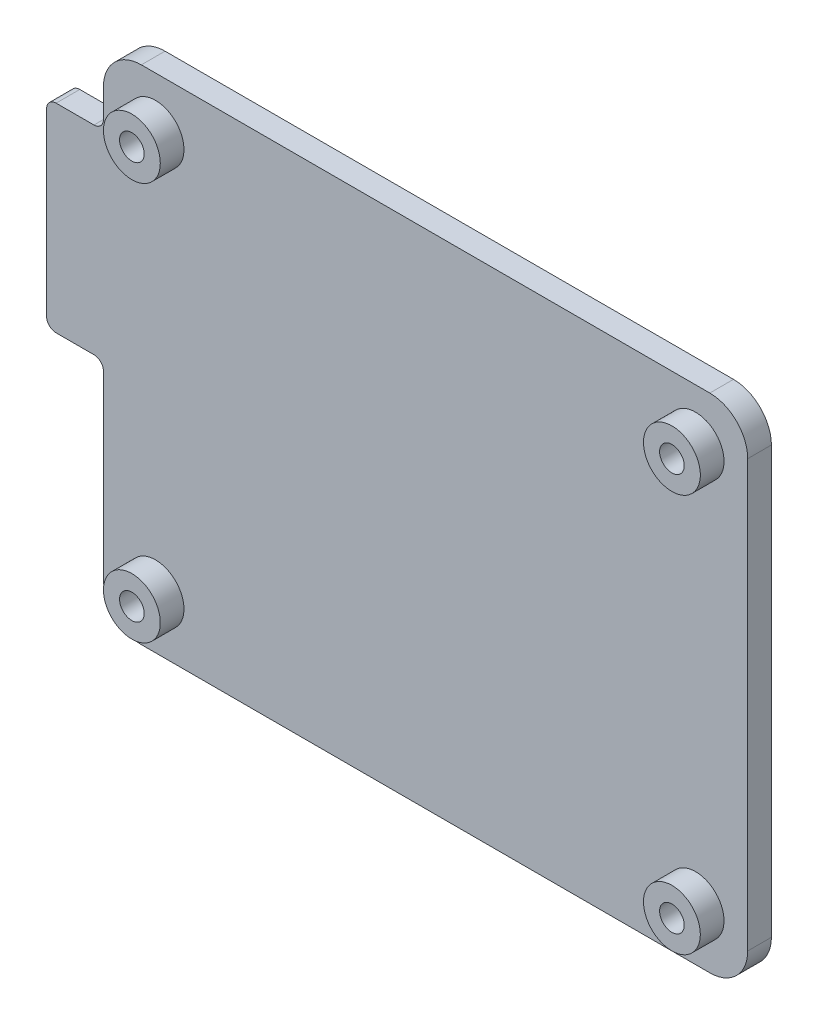
ISO-10303-21;
HEADER;
FILE_DESCRIPTION(('STEP AP214'),'2;1');
FILE_NAME('part.step','',(''),(''),'','','');
FILE_SCHEMA(('AUTOMOTIVE_DESIGN { 1 0 10303 214 1 1 1 1 }'));
ENDSEC;
DATA;
#1=APPLICATION_CONTEXT('core data for automotive mechanical design processes');
#2=APPLICATION_PROTOCOL_DEFINITION('international standard','automotive_design',2000,#1);
#3=PRODUCT_CONTEXT('',#1,'mechanical');
#4=PRODUCT('Part','Part','',(#3));
#5=PRODUCT_RELATED_PRODUCT_CATEGORY('part','',(#4));
#6=PRODUCT_DEFINITION_FORMATION('','',#4);
#7=PRODUCT_DEFINITION_CONTEXT('part definition',#1,'design');
#8=PRODUCT_DEFINITION('design','',#6,#7);
#9=PRODUCT_DEFINITION_SHAPE('','',#8);
#10=(LENGTH_UNIT() NAMED_UNIT(*) SI_UNIT(.MILLI.,.METRE.));
#11=(NAMED_UNIT(*) PLANE_ANGLE_UNIT() SI_UNIT($,.RADIAN.));
#12=(NAMED_UNIT(*) SI_UNIT($,.STERADIAN.) SOLID_ANGLE_UNIT());
#13=UNCERTAINTY_MEASURE_WITH_UNIT(LENGTH_MEASURE(1.E-05),#10,'distance_accuracy_value','');
#14=(GEOMETRIC_REPRESENTATION_CONTEXT(3) GLOBAL_UNCERTAINTY_ASSIGNED_CONTEXT((#13)) GLOBAL_UNIT_ASSIGNED_CONTEXT((#10,
#11,#12)) REPRESENTATION_CONTEXT('',''));
#15=CARTESIAN_POINT('',(0.,0.,0.));
#16=DIRECTION('',(0.,0.,1.));
#17=DIRECTION('',(1.,0.,0.));
#18=AXIS2_PLACEMENT_3D('',#15,#16,#17);
#19=CARTESIAN_POINT('',(-34.,-26.5,2.5));
#20=DIRECTION('',(1.,0.,0.));
#21=DIRECTION('',(0.,0.,-1.));
#22=AXIS2_PLACEMENT_3D('',#19,#20,#21);
#23=PLANE('',#22);
#24=DIRECTION('',(0.,-1.,0.));
#25=VECTOR('',#24,1.);
#26=CARTESIAN_POINT('',(-34.,-26.5,2.5));
#27=LINE('',#26,#25);
#28=CARTESIAN_POINT('',(-34.,-3.5,2.5));
#29=VERTEX_POINT('',#28);
#30=CARTESIAN_POINT('',(-34.,-22.5,2.5));
#31=VERTEX_POINT('',#30);
#32=EDGE_CURVE('E368',#29,#31,#27,.T.);
#33=ORIENTED_EDGE('',*,*,#32,.F.);
#34=DIRECTION('',(0.,0.,1.));
#35=VECTOR('',#34,1.);
#36=CARTESIAN_POINT('',(-34.,-3.5,2.5));
#37=LINE('',#36,#35);
#38=CARTESIAN_POINT('',(-34.,-3.5,0.));
#39=VERTEX_POINT('',#38);
#40=EDGE_CURVE('E280',#29,#39,#37,.F.);
#41=ORIENTED_EDGE('',*,*,#40,.T.);
#42=DIRECTION('',(0.,-1.,0.));
#43=VECTOR('',#42,1.);
#44=CARTESIAN_POINT('',(-34.,-26.5,0.));
#45=LINE('',#44,#43);
#46=CARTESIAN_POINT('',(-34.,-22.5,0.));
#47=VERTEX_POINT('',#46);
#48=EDGE_CURVE('E195',#39,#47,#45,.T.);
#49=ORIENTED_EDGE('',*,*,#48,.T.);
#50=DIRECTION('',(0.,0.,-1.));
#51=VECTOR('',#50,1.);
#52=CARTESIAN_POINT('',(-34.,-22.5,2.5));
#53=LINE('',#52,#51);
#54=EDGE_CURVE('E164',#47,#31,#53,.F.);
#55=ORIENTED_EDGE('',*,*,#54,.T.);
#56=EDGE_LOOP('',(#33,#41,#49,#55));
#57=FACE_BOUND('',#56,.T.);
#58=ADVANCED_FACE('F42',(#57),#23,.F.);
#59=CARTESIAN_POINT('',(34.,-26.5,2.5));
#60=DIRECTION('',(-1.,0.,0.));
#61=DIRECTION('',(0.,0.,1.));
#62=AXIS2_PLACEMENT_3D('',#59,#60,#61);
#63=PLANE('',#62);
#64=DIRECTION('',(0.,1.,0.));
#65=VECTOR('',#64,1.);
#66=CARTESIAN_POINT('',(34.,-26.5,2.5));
#67=LINE('',#66,#65);
#68=CARTESIAN_POINT('',(34.,-22.5,2.5));
#69=VERTEX_POINT('',#68);
#70=CARTESIAN_POINT('',(34.,22.5,2.5));
#71=VERTEX_POINT('',#70);
#72=EDGE_CURVE('E186',#69,#71,#67,.T.);
#73=ORIENTED_EDGE('',*,*,#72,.F.);
#74=DIRECTION('',(0.,0.,-1.));
#75=VECTOR('',#74,1.);
#76=CARTESIAN_POINT('',(34.,-22.5,2.5));
#77=LINE('',#76,#75);
#78=CARTESIAN_POINT('',(34.,-22.5,0.));
#79=VERTEX_POINT('',#78);
#80=EDGE_CURVE('E244',#69,#79,#77,.T.);
#81=ORIENTED_EDGE('',*,*,#80,.T.);
#82=DIRECTION('',(0.,1.,0.));
#83=VECTOR('',#82,1.);
#84=CARTESIAN_POINT('',(34.,-26.5,0.));
#85=LINE('',#84,#83);
#86=CARTESIAN_POINT('',(34.,22.5,0.));
#87=VERTEX_POINT('',#86);
#88=EDGE_CURVE('E357',#79,#87,#85,.T.);
#89=ORIENTED_EDGE('',*,*,#88,.T.);
#90=DIRECTION('',(0.,0.,-1.));
#91=VECTOR('',#90,1.);
#92=CARTESIAN_POINT('',(34.,22.5,2.5));
#93=LINE('',#92,#91);
#94=EDGE_CURVE('E241',#87,#71,#93,.F.);
#95=ORIENTED_EDGE('',*,*,#94,.T.);
#96=EDGE_LOOP('',(#73,#81,#89,#95));
#97=FACE_BOUND('',#96,.T.);
#98=ADVANCED_FACE('F470',(#97),#63,.F.);
#99=CARTESIAN_POINT('',(-34.,26.5,2.5));
#100=DIRECTION('',(0.,-1.,0.));
#101=DIRECTION('',(0.,0.,-1.));
#102=AXIS2_PLACEMENT_3D('',#99,#100,#101);
#103=PLANE('',#102);
#104=DIRECTION('',(-1.,0.,0.));
#105=VECTOR('',#104,1.);
#106=CARTESIAN_POINT('',(-34.,26.5,2.5));
#107=LINE('',#106,#105);
#108=CARTESIAN_POINT('',(30.,26.5,2.5));
#109=VERTEX_POINT('',#108);
#110=CARTESIAN_POINT('',(-30.,26.5,2.5));
#111=VERTEX_POINT('',#110);
#112=EDGE_CURVE('E192',#109,#111,#107,.T.);
#113=ORIENTED_EDGE('',*,*,#112,.F.);
#114=DIRECTION('',(0.,0.,-1.));
#115=VECTOR('',#114,1.);
#116=CARTESIAN_POINT('',(30.,26.5,2.5));
#117=LINE('',#116,#115);
#118=CARTESIAN_POINT('',(30.,26.5,0.));
#119=VERTEX_POINT('',#118);
#120=EDGE_CURVE('E251',#109,#119,#117,.T.);
#121=ORIENTED_EDGE('',*,*,#120,.T.);
#122=DIRECTION('',(-1.,0.,0.));
#123=VECTOR('',#122,1.);
#124=CARTESIAN_POINT('',(-34.,26.5,0.));
#125=LINE('',#124,#123);
#126=CARTESIAN_POINT('',(-30.,26.5,0.));
#127=VERTEX_POINT('',#126);
#128=EDGE_CURVE('E350',#119,#127,#125,.T.);
#129=ORIENTED_EDGE('',*,*,#128,.T.);
#130=DIRECTION('',(0.,0.,-1.));
#131=VECTOR('',#130,1.);
#132=CARTESIAN_POINT('',(-30.,26.5,2.5));
#133=LINE('',#132,#131);
#134=EDGE_CURVE('E248',#127,#111,#133,.F.);
#135=ORIENTED_EDGE('',*,*,#134,.T.);
#136=EDGE_LOOP('',(#113,#121,#129,#135));
#137=FACE_BOUND('',#136,.T.);
#138=ADVANCED_FACE('F353',(#137),#103,.F.);
#139=CARTESIAN_POINT('',(-34.,22.5,0.));
#140=VERTEX_POINT('',#139);
#141=CARTESIAN_POINT('',(-34.,19.5,0.));
#142=VERTEX_POINT('',#141);
#143=EDGE_CURVE('E187',#140,#142,#45,.T.);
#144=ORIENTED_EDGE('',*,*,#143,.T.);
#145=DIRECTION('',(0.,0.,1.));
#146=VECTOR('',#145,1.);
#147=CARTESIAN_POINT('',(-34.,19.5,2.5));
#148=LINE('',#147,#146);
#149=CARTESIAN_POINT('',(-34.,19.5,2.5));
#150=VERTEX_POINT('',#149);
#151=EDGE_CURVE('E283',#142,#150,#148,.T.);
#152=ORIENTED_EDGE('',*,*,#151,.T.);
#153=CARTESIAN_POINT('',(-34.,22.5,2.5));
#154=VERTEX_POINT('',#153);
#155=EDGE_CURVE('E325',#154,#150,#27,.T.);
#156=ORIENTED_EDGE('',*,*,#155,.F.);
#157=DIRECTION('',(0.,0.,-1.));
#158=VECTOR('',#157,1.);
#159=CARTESIAN_POINT('',(-34.,22.5,2.5));
#160=LINE('',#159,#158);
#161=EDGE_CURVE('E168',#154,#140,#160,.T.);
#162=ORIENTED_EDGE('',*,*,#161,.T.);
#163=EDGE_LOOP('',(#144,#152,#156,#162));
#164=FACE_BOUND('',#163,.T.);
#165=ADVANCED_FACE('F342',(#164),#23,.F.);
#166=CARTESIAN_POINT('',(-34.,-26.5,2.5));
#167=DIRECTION('',(0.,1.,0.));
#168=DIRECTION('',(0.,0.,1.));
#169=AXIS2_PLACEMENT_3D('',#166,#167,#168);
#170=PLANE('',#169);
#171=DIRECTION('',(1.,0.,0.));
#172=VECTOR('',#171,1.);
#173=CARTESIAN_POINT('',(-34.,-26.5,2.5));
#174=LINE('',#173,#172);
#175=CARTESIAN_POINT('',(-30.,-26.5,2.5));
#176=VERTEX_POINT('',#175);
#177=CARTESIAN_POINT('',(30.,-26.5,2.5));
#178=VERTEX_POINT('',#177);
#179=EDGE_CURVE('E178',#176,#178,#174,.T.);
#180=ORIENTED_EDGE('',*,*,#179,.F.);
#181=DIRECTION('',(0.,0.,-1.));
#182=VECTOR('',#181,1.);
#183=CARTESIAN_POINT('',(-30.,-26.5,2.5));
#184=LINE('',#183,#182);
#185=CARTESIAN_POINT('',(-30.,-26.5,0.));
#186=VERTEX_POINT('',#185);
#187=EDGE_CURVE('E162',#176,#186,#184,.T.);
#188=ORIENTED_EDGE('',*,*,#187,.T.);
#189=DIRECTION('',(1.,0.,0.));
#190=VECTOR('',#189,1.);
#191=CARTESIAN_POINT('',(-34.,-26.5,0.));
#192=LINE('',#191,#190);
#193=CARTESIAN_POINT('',(30.,-26.5,0.));
#194=VERTEX_POINT('',#193);
#195=EDGE_CURVE('E175',#186,#194,#192,.T.);
#196=ORIENTED_EDGE('',*,*,#195,.T.);
#197=DIRECTION('',(0.,0.,-1.));
#198=VECTOR('',#197,1.);
#199=CARTESIAN_POINT('',(30.,-26.5,2.5));
#200=LINE('',#199,#198);
#201=EDGE_CURVE('E181',#194,#178,#200,.F.);
#202=ORIENTED_EDGE('',*,*,#201,.T.);
#203=EDGE_LOOP('',(#180,#188,#196,#202));
#204=FACE_BOUND('',#203,.T.);
#205=ADVANCED_FACE('F174',(#204),#170,.F.);
#206=CARTESIAN_POINT('',(0.,0.,2.5));
#207=DIRECTION('',(0.,0.,-1.));
#208=DIRECTION('',(-1.,0.,0.));
#209=AXIS2_PLACEMENT_3D('',#206,#207,#208);
#210=PLANE('',#209);
#211=CARTESIAN_POINT('',(28.5,21.,2.5));
#212=DIRECTION('',(0.,0.,-1.));
#213=DIRECTION('',(-1.,0.,0.));
#214=AXIS2_PLACEMENT_3D('',#211,#212,#213);
#215=CIRCLE('',#214,2.99999999999999);
#216=CARTESIAN_POINT('',(25.5,21.,2.5));
#217=VERTEX_POINT('',#216);
#218=EDGE_CURVE('E211',#217,#217,#215,.F.);
#219=ORIENTED_EDGE('',*,*,#218,.F.);
#220=EDGE_LOOP('',(#219));
#221=FACE_BOUND('',#220,.T.);
#222=CARTESIAN_POINT('',(28.5,-21.,2.5));
#223=DIRECTION('',(0.,0.,-1.));
#224=DIRECTION('',(-1.,0.,0.));
#225=AXIS2_PLACEMENT_3D('',#222,#223,#224);
#226=CIRCLE('',#225,2.99999999999999);
#227=CARTESIAN_POINT('',(25.5,-21.,2.5));
#228=VERTEX_POINT('',#227);
#229=EDGE_CURVE('E207',#228,#228,#226,.F.);
#230=ORIENTED_EDGE('',*,*,#229,.F.);
#231=EDGE_LOOP('',(#230));
#232=FACE_BOUND('',#231,.T.);
#233=CARTESIAN_POINT('',(-28.5,-21.,2.5));
#234=DIRECTION('',(0.,0.,-1.));
#235=DIRECTION('',(-1.,0.,0.));
#236=AXIS2_PLACEMENT_3D('',#233,#234,#235);
#237=CIRCLE('',#236,2.99999999999999);
#238=CARTESIAN_POINT('',(-31.5,-21.,2.5));
#239=VERTEX_POINT('',#238);
#240=EDGE_CURVE('E203',#239,#239,#237,.F.);
#241=ORIENTED_EDGE('',*,*,#240,.F.);
#242=EDGE_LOOP('',(#241));
#243=FACE_BOUND('',#242,.T.);
#244=CARTESIAN_POINT('',(-28.5,21.,2.5));
#245=DIRECTION('',(0.,0.,-1.));
#246=DIRECTION('',(-1.,0.,0.));
#247=AXIS2_PLACEMENT_3D('',#244,#245,#246);
#248=CIRCLE('',#247,2.99999999999999);
#249=CARTESIAN_POINT('',(-31.5,21.,2.5));
#250=VERTEX_POINT('',#249);
#251=EDGE_CURVE('E199',#250,#250,#248,.F.);
#252=ORIENTED_EDGE('',*,*,#251,.F.);
#253=EDGE_LOOP('',(#252));
#254=FACE_BOUND('',#253,.T.);
#255=DIRECTION('',(0.,-1.,0.));
#256=VECTOR('',#255,1.);
#257=CARTESIAN_POINT('',(-40.,18.5,2.5));
#258=LINE('',#257,#256);
#259=CARTESIAN_POINT('',(-40.,17.5,2.5));
#260=VERTEX_POINT('',#259);
#261=CARTESIAN_POINT('',(-40.,-1.49999999999999,2.5));
#262=VERTEX_POINT('',#261);
#263=EDGE_CURVE('E335',#260,#262,#258,.T.);
#264=ORIENTED_EDGE('',*,*,#263,.T.);
#265=CARTESIAN_POINT('',(-39.,-1.5,2.5));
#266=DIRECTION('',(0.,0.,-1.));
#267=DIRECTION('',(-1.,0.,0.));
#268=AXIS2_PLACEMENT_3D('',#265,#266,#267);
#269=CIRCLE('',#268,1.);
#270=CARTESIAN_POINT('',(-39.,-2.5,2.5));
#271=VERTEX_POINT('',#270);
#272=EDGE_CURVE('E303',#262,#271,#269,.F.);
#273=ORIENTED_EDGE('',*,*,#272,.T.);
#274=DIRECTION('',(1.,0.,0.));
#275=VECTOR('',#274,1.);
#276=CARTESIAN_POINT('',(-34.,-2.5,2.5));
#277=LINE('',#276,#275);
#278=CARTESIAN_POINT('',(-35.,-2.5,2.5));
#279=VERTEX_POINT('',#278);
#280=EDGE_CURVE('E433',#271,#279,#277,.T.);
#281=ORIENTED_EDGE('',*,*,#280,.T.);
#282=CARTESIAN_POINT('',(-35.,-3.5,2.5));
#283=DIRECTION('',(0.,0.,-1.));
#284=DIRECTION('',(-1.,0.,0.));
#285=AXIS2_PLACEMENT_3D('',#282,#283,#284);
#286=CIRCLE('',#285,1.);
#287=EDGE_CURVE('E311',#279,#29,#286,.T.);
#288=ORIENTED_EDGE('',*,*,#287,.T.);
#289=ORIENTED_EDGE('',*,*,#32,.T.);
#290=CARTESIAN_POINT('',(-30.,-22.5,2.5));
#291=DIRECTION('',(0.,0.,-1.));
#292=DIRECTION('',(-1.,0.,0.));
#293=AXIS2_PLACEMENT_3D('',#290,#291,#292);
#294=CIRCLE('',#293,4.);
#295=EDGE_CURVE('E238',#31,#176,#294,.F.);
#296=ORIENTED_EDGE('',*,*,#295,.T.);
#297=ORIENTED_EDGE('',*,*,#179,.T.);
#298=CARTESIAN_POINT('',(30.,-22.5,2.5));
#299=DIRECTION('',(0.,0.,-1.));
#300=DIRECTION('',(-1.,0.,0.));
#301=AXIS2_PLACEMENT_3D('',#298,#299,#300);
#302=CIRCLE('',#301,4.);
#303=EDGE_CURVE('E235',#178,#69,#302,.F.);
#304=ORIENTED_EDGE('',*,*,#303,.T.);
#305=ORIENTED_EDGE('',*,*,#72,.T.);
#306=CARTESIAN_POINT('',(30.,22.5,2.5));
#307=DIRECTION('',(0.,0.,-1.));
#308=DIRECTION('',(-1.,0.,0.));
#309=AXIS2_PLACEMENT_3D('',#306,#307,#308);
#310=CIRCLE('',#309,4.);
#311=EDGE_CURVE('E232',#71,#109,#310,.F.);
#312=ORIENTED_EDGE('',*,*,#311,.T.);
#313=ORIENTED_EDGE('',*,*,#112,.T.);
#314=CARTESIAN_POINT('',(-30.,22.5,2.5));
#315=DIRECTION('',(0.,0.,-1.));
#316=DIRECTION('',(-1.,0.,0.));
#317=AXIS2_PLACEMENT_3D('',#314,#315,#316);
#318=CIRCLE('',#317,4.);
#319=EDGE_CURVE('E229',#111,#154,#318,.F.);
#320=ORIENTED_EDGE('',*,*,#319,.T.);
#321=ORIENTED_EDGE('',*,*,#155,.T.);
#322=CARTESIAN_POINT('',(-35.,19.5,2.5));
#323=DIRECTION('',(0.,0.,-1.));
#324=DIRECTION('',(-1.,0.,0.));
#325=AXIS2_PLACEMENT_3D('',#322,#323,#324);
#326=CIRCLE('',#325,1.);
#327=CARTESIAN_POINT('',(-35.,18.5,2.5));
#328=VERTEX_POINT('',#327);
#329=EDGE_CURVE('E51',#150,#328,#326,.T.);
#330=ORIENTED_EDGE('',*,*,#329,.T.);
#331=DIRECTION('',(-1.,0.,0.));
#332=VECTOR('',#331,1.);
#333=CARTESIAN_POINT('',(-34.,18.5,2.5));
#334=LINE('',#333,#332);
#335=CARTESIAN_POINT('',(-39.,18.5,2.5));
#336=VERTEX_POINT('',#335);
#337=EDGE_CURVE('E323',#328,#336,#334,.T.);
#338=ORIENTED_EDGE('',*,*,#337,.T.);
#339=CARTESIAN_POINT('',(-39.,17.5,2.5));
#340=DIRECTION('',(0.,0.,-1.));
#341=DIRECTION('',(-1.,0.,0.));
#342=AXIS2_PLACEMENT_3D('',#339,#340,#341);
#343=CIRCLE('',#342,1.);
#344=EDGE_CURVE('E300',#336,#260,#343,.F.);
#345=ORIENTED_EDGE('',*,*,#344,.T.);
#346=EDGE_LOOP('',(#264,#273,#281,#288,#289,#296,#297,#304,#305,#312,#313,#320,#321,#330,#338,#345));
#347=FACE_BOUND('',#346,.T.);
#348=ADVANCED_FACE('F322',(#221,#232,#243,#254,#347),#210,.F.);
#349=CARTESIAN_POINT('',(0.,0.,0.));
#350=DIRECTION('',(0.,0.,-1.));
#351=DIRECTION('',(-1.,0.,0.));
#352=AXIS2_PLACEMENT_3D('',#349,#350,#351);
#353=PLANE('',#352);
#354=CARTESIAN_POINT('',(28.5,21.,0.));
#355=DIRECTION('',(0.,0.,1.));
#356=DIRECTION('',(-1.,0.,0.));
#357=AXIS2_PLACEMENT_3D('',#354,#355,#356);
#358=CIRCLE('',#357,2.2);
#359=CARTESIAN_POINT('',(26.3,21.,0.));
#360=VERTEX_POINT('',#359);
#361=EDGE_CURVE('E273',#360,#360,#358,.T.);
#362=ORIENTED_EDGE('',*,*,#361,.T.);
#363=EDGE_LOOP('',(#362));
#364=FACE_BOUND('',#363,.T.);
#365=CARTESIAN_POINT('',(28.5,-21.,0.));
#366=DIRECTION('',(0.,0.,1.));
#367=DIRECTION('',(1.,0.,0.));
#368=AXIS2_PLACEMENT_3D('',#365,#366,#367);
#369=CIRCLE('',#368,2.2);
#370=CARTESIAN_POINT('',(30.7,-21.,0.));
#371=VERTEX_POINT('',#370);
#372=EDGE_CURVE('E418',#371,#371,#369,.T.);
#373=ORIENTED_EDGE('',*,*,#372,.T.);
#374=EDGE_LOOP('',(#373));
#375=FACE_BOUND('',#374,.T.);
#376=CARTESIAN_POINT('',(-28.5,-21.,0.));
#377=DIRECTION('',(0.,0.,1.));
#378=DIRECTION('',(-1.,0.,0.));
#379=AXIS2_PLACEMENT_3D('',#376,#377,#378);
#380=CIRCLE('',#379,2.2);
#381=CARTESIAN_POINT('',(-30.7,-21.,0.));
#382=VERTEX_POINT('',#381);
#383=EDGE_CURVE('E426',#382,#382,#380,.T.);
#384=ORIENTED_EDGE('',*,*,#383,.T.);
#385=EDGE_LOOP('',(#384));
#386=FACE_BOUND('',#385,.T.);
#387=CARTESIAN_POINT('',(-28.5,21.,0.));
#388=DIRECTION('',(0.,0.,1.));
#389=DIRECTION('',(1.,0.,0.));
#390=AXIS2_PLACEMENT_3D('',#387,#388,#389);
#391=CIRCLE('',#390,2.2);
#392=CARTESIAN_POINT('',(-26.3,21.,0.));
#393=VERTEX_POINT('',#392);
#394=EDGE_CURVE('E402',#393,#393,#391,.T.);
#395=ORIENTED_EDGE('',*,*,#394,.T.);
#396=EDGE_LOOP('',(#395));
#397=FACE_BOUND('',#396,.T.);
#398=DIRECTION('',(1.,0.,0.));
#399=VECTOR('',#398,1.);
#400=CARTESIAN_POINT('',(-34.,-2.5,0.));
#401=LINE('',#400,#399);
#402=CARTESIAN_POINT('',(-39.,-2.5,0.));
#403=VERTEX_POINT('',#402);
#404=CARTESIAN_POINT('',(-35.,-2.5,0.));
#405=VERTEX_POINT('',#404);
#406=EDGE_CURVE('E261',#403,#405,#401,.T.);
#407=ORIENTED_EDGE('',*,*,#406,.F.);
#408=CARTESIAN_POINT('',(-39.,-1.5,0.));
#409=DIRECTION('',(0.,0.,-1.));
#410=DIRECTION('',(-1.,0.,0.));
#411=AXIS2_PLACEMENT_3D('',#408,#409,#410);
#412=CIRCLE('',#411,1.);
#413=CARTESIAN_POINT('',(-40.,-1.49999999999999,0.));
#414=VERTEX_POINT('',#413);
#415=EDGE_CURVE('E58',#403,#414,#412,.T.);
#416=ORIENTED_EDGE('',*,*,#415,.T.);
#417=DIRECTION('',(0.,-1.,0.));
#418=VECTOR('',#417,1.);
#419=CARTESIAN_POINT('',(-40.,18.5,0.));
#420=LINE('',#419,#418);
#421=CARTESIAN_POINT('',(-40.,17.5,0.));
#422=VERTEX_POINT('',#421);
#423=EDGE_CURVE('E442',#422,#414,#420,.T.);
#424=ORIENTED_EDGE('',*,*,#423,.F.);
#425=CARTESIAN_POINT('',(-39.,17.5,0.));
#426=DIRECTION('',(0.,0.,-1.));
#427=DIRECTION('',(-1.,0.,0.));
#428=AXIS2_PLACEMENT_3D('',#425,#426,#427);
#429=CIRCLE('',#428,1.);
#430=CARTESIAN_POINT('',(-39.,18.5,0.));
#431=VERTEX_POINT('',#430);
#432=EDGE_CURVE('E306',#422,#431,#429,.T.);
#433=ORIENTED_EDGE('',*,*,#432,.T.);
#434=DIRECTION('',(-1.,0.,0.));
#435=VECTOR('',#434,1.);
#436=CARTESIAN_POINT('',(-34.,18.5,0.));
#437=LINE('',#436,#435);
#438=CARTESIAN_POINT('',(-35.,18.5,0.));
#439=VERTEX_POINT('',#438);
#440=EDGE_CURVE('E340',#439,#431,#437,.T.);
#441=ORIENTED_EDGE('',*,*,#440,.F.);
#442=CARTESIAN_POINT('',(-35.,19.5,0.));
#443=DIRECTION('',(0.,0.,-1.));
#444=DIRECTION('',(-1.,0.,0.));
#445=AXIS2_PLACEMENT_3D('',#442,#443,#444);
#446=CIRCLE('',#445,1.);
#447=EDGE_CURVE('E11',#439,#142,#446,.F.);
#448=ORIENTED_EDGE('',*,*,#447,.T.);
#449=ORIENTED_EDGE('',*,*,#143,.F.);
#450=CARTESIAN_POINT('',(-30.,22.5,0.));
#451=DIRECTION('',(0.,0.,-1.));
#452=DIRECTION('',(-1.,0.,0.));
#453=AXIS2_PLACEMENT_3D('',#450,#451,#452);
#454=CIRCLE('',#453,4.);
#455=EDGE_CURVE('E180',#140,#127,#454,.T.);
#456=ORIENTED_EDGE('',*,*,#455,.T.);
#457=ORIENTED_EDGE('',*,*,#128,.F.);
#458=CARTESIAN_POINT('',(30.,22.5,0.));
#459=DIRECTION('',(0.,0.,-1.));
#460=DIRECTION('',(-1.,0.,0.));
#461=AXIS2_PLACEMENT_3D('',#458,#459,#460);
#462=CIRCLE('',#461,4.);
#463=EDGE_CURVE('E219',#119,#87,#462,.T.);
#464=ORIENTED_EDGE('',*,*,#463,.T.);
#465=ORIENTED_EDGE('',*,*,#88,.F.);
#466=CARTESIAN_POINT('',(30.,-22.5,0.));
#467=DIRECTION('',(0.,0.,-1.));
#468=DIRECTION('',(-1.,0.,0.));
#469=AXIS2_PLACEMENT_3D('',#466,#467,#468);
#470=CIRCLE('',#469,4.);
#471=EDGE_CURVE('E169',#79,#194,#470,.T.);
#472=ORIENTED_EDGE('',*,*,#471,.T.);
#473=ORIENTED_EDGE('',*,*,#195,.F.);
#474=CARTESIAN_POINT('',(-30.,-22.5,0.));
#475=DIRECTION('',(0.,0.,-1.));
#476=DIRECTION('',(-1.,0.,0.));
#477=AXIS2_PLACEMENT_3D('',#474,#475,#476);
#478=CIRCLE('',#477,4.);
#479=EDGE_CURVE('E158',#186,#47,#478,.T.);
#480=ORIENTED_EDGE('',*,*,#479,.T.);
#481=ORIENTED_EDGE('',*,*,#48,.F.);
#482=CARTESIAN_POINT('',(-35.,-3.5,0.));
#483=DIRECTION('',(0.,0.,-1.));
#484=DIRECTION('',(-1.,0.,0.));
#485=AXIS2_PLACEMENT_3D('',#482,#483,#484);
#486=CIRCLE('',#485,1.);
#487=EDGE_CURVE('E314',#39,#405,#486,.F.);
#488=ORIENTED_EDGE('',*,*,#487,.T.);
#489=EDGE_LOOP('',(#407,#416,#424,#433,#441,#448,#449,#456,#457,#464,#465,#472,#473,#480,#481,#488));
#490=FACE_BOUND('',#489,.T.);
#491=ADVANCED_FACE('F183',(#364,#375,#386,#397,#490),#353,.T.);
#492=CARTESIAN_POINT('',(-28.5,21.,5.));
#493=DIRECTION('',(0.,0.,1.));
#494=DIRECTION('',(1.,0.,0.));
#495=AXIS2_PLACEMENT_3D('',#492,#493,#494);
#496=PLANE('',#495);
#497=CARTESIAN_POINT('',(-28.5,21.,5.));
#498=DIRECTION('',(0.,0.,1.));
#499=DIRECTION('',(1.,0.,0.));
#500=AXIS2_PLACEMENT_3D('',#497,#498,#499);
#501=CIRCLE('',#500,2.99999999999999);
#502=CARTESIAN_POINT('',(-25.5,21.,5.));
#503=VERTEX_POINT('',#502);
#504=EDGE_CURVE('E361',#503,#503,#501,.T.);
#505=ORIENTED_EDGE('',*,*,#504,.T.);
#506=EDGE_LOOP('',(#505));
#507=FACE_BOUND('',#506,.T.);
#508=CARTESIAN_POINT('',(-28.5,21.,5.));
#509=DIRECTION('',(0.,0.,1.));
#510=DIRECTION('',(1.,0.,0.));
#511=AXIS2_PLACEMENT_3D('',#508,#509,#510);
#512=CIRCLE('',#511,1.3);
#513=CARTESIAN_POINT('',(-27.2,21.,5.));
#514=VERTEX_POINT('',#513);
#515=EDGE_CURVE('E374',#514,#514,#512,.T.);
#516=ORIENTED_EDGE('',*,*,#515,.F.);
#517=EDGE_LOOP('',(#516));
#518=FACE_BOUND('',#517,.T.);
#519=ADVANCED_FACE('F548',(#507,#518),#496,.T.);
#520=CARTESIAN_POINT('',(-28.5,21.,5.));
#521=DIRECTION('',(0.,0.,-1.));
#522=DIRECTION('',(-1.,0.,0.));
#523=AXIS2_PLACEMENT_3D('',#520,#521,#522);
#524=CYLINDRICAL_SURFACE('',#523,2.99999999999999);
#525=ORIENTED_EDGE('',*,*,#504,.F.);
#526=EDGE_LOOP('',(#525));
#527=FACE_BOUND('',#526,.T.);
#528=ORIENTED_EDGE('',*,*,#251,.T.);
#529=EDGE_LOOP('',(#528));
#530=FACE_BOUND('',#529,.T.);
#531=ADVANCED_FACE('F546',(#527,#530),#524,.T.);
#532=CARTESIAN_POINT('',(-28.5,21.,5.));
#533=DIRECTION('',(0.,0.,-1.));
#534=DIRECTION('',(-1.,0.,0.));
#535=AXIS2_PLACEMENT_3D('',#532,#533,#534);
#536=CYLINDRICAL_SURFACE('',#535,1.3);
#537=ORIENTED_EDGE('',*,*,#515,.T.);
#538=EDGE_LOOP('',(#537));
#539=FACE_BOUND('',#538,.T.);
#540=CARTESIAN_POINT('',(-28.5,21.,1.8));
#541=DIRECTION('',(0.,0.,1.));
#542=DIRECTION('',(1.,0.,0.));
#543=AXIS2_PLACEMENT_3D('',#540,#541,#542);
#544=CIRCLE('',#543,1.3);
#545=CARTESIAN_POINT('',(-27.2,21.,1.8));
#546=VERTEX_POINT('',#545);
#547=EDGE_CURVE('E269',#546,#546,#544,.T.);
#548=ORIENTED_EDGE('',*,*,#547,.F.);
#549=EDGE_LOOP('',(#548));
#550=FACE_BOUND('',#549,.T.);
#551=ADVANCED_FACE('F539',(#539,#550),#536,.F.);
#552=CARTESIAN_POINT('',(-28.5,-21.,5.));
#553=DIRECTION('',(0.,0.,-1.));
#554=DIRECTION('',(-1.,0.,0.));
#555=AXIS2_PLACEMENT_3D('',#552,#553,#554);
#556=PLANE('',#555);
#557=CARTESIAN_POINT('',(-28.5,-21.,5.));
#558=DIRECTION('',(0.,0.,1.));
#559=DIRECTION('',(-1.,0.,0.));
#560=AXIS2_PLACEMENT_3D('',#557,#558,#559);
#561=CIRCLE('',#560,2.99999999999999);
#562=CARTESIAN_POINT('',(-31.5,-21.,5.));
#563=VERTEX_POINT('',#562);
#564=EDGE_CURVE('E382',#563,#563,#561,.T.);
#565=ORIENTED_EDGE('',*,*,#564,.T.);
#566=EDGE_LOOP('',(#565));
#567=FACE_BOUND('',#566,.T.);
#568=CARTESIAN_POINT('',(-28.5,-21.,5.));
#569=DIRECTION('',(0.,0.,1.));
#570=DIRECTION('',(-1.,0.,0.));
#571=AXIS2_PLACEMENT_3D('',#568,#569,#570);
#572=CIRCLE('',#571,1.3);
#573=CARTESIAN_POINT('',(-29.8,-21.,5.));
#574=VERTEX_POINT('',#573);
#575=EDGE_CURVE('E378',#574,#574,#572,.T.);
#576=ORIENTED_EDGE('',*,*,#575,.F.);
#577=EDGE_LOOP('',(#576));
#578=FACE_BOUND('',#577,.T.);
#579=ADVANCED_FACE('F535',(#567,#578),#556,.F.);
#580=CARTESIAN_POINT('',(-28.5,-21.,5.));
#581=DIRECTION('',(0.,0.,-1.));
#582=DIRECTION('',(-1.,0.,0.));
#583=AXIS2_PLACEMENT_3D('',#580,#581,#582);
#584=CYLINDRICAL_SURFACE('',#583,2.99999999999999);
#585=ORIENTED_EDGE('',*,*,#564,.F.);
#586=EDGE_LOOP('',(#585));
#587=FACE_BOUND('',#586,.T.);
#588=ORIENTED_EDGE('',*,*,#240,.T.);
#589=EDGE_LOOP('',(#588));
#590=FACE_BOUND('',#589,.T.);
#591=ADVANCED_FACE('F532',(#587,#590),#584,.T.);
#592=CARTESIAN_POINT('',(-28.5,-21.,5.));
#593=DIRECTION('',(0.,0.,-1.));
#594=DIRECTION('',(-1.,0.,0.));
#595=AXIS2_PLACEMENT_3D('',#592,#593,#594);
#596=CYLINDRICAL_SURFACE('',#595,1.3);
#597=ORIENTED_EDGE('',*,*,#575,.T.);
#598=EDGE_LOOP('',(#597));
#599=FACE_BOUND('',#598,.T.);
#600=CARTESIAN_POINT('',(-28.5,-21.,1.8));
#601=DIRECTION('',(0.,0.,-1.));
#602=DIRECTION('',(-1.,0.,0.));
#603=AXIS2_PLACEMENT_3D('',#600,#601,#602);
#604=CIRCLE('',#603,1.3);
#605=CARTESIAN_POINT('',(-29.8,-21.,1.8));
#606=VERTEX_POINT('',#605);
#607=EDGE_CURVE('E265',#606,#606,#604,.T.);
#608=ORIENTED_EDGE('',*,*,#607,.T.);
#609=EDGE_LOOP('',(#608));
#610=FACE_BOUND('',#609,.T.);
#611=ADVANCED_FACE('F527',(#599,#610),#596,.F.);
#612=CARTESIAN_POINT('',(28.5,-21.,5.));
#613=DIRECTION('',(0.,0.,1.));
#614=DIRECTION('',(1.,0.,0.));
#615=AXIS2_PLACEMENT_3D('',#612,#613,#614);
#616=PLANE('',#615);
#617=CARTESIAN_POINT('',(28.5,-21.,5.));
#618=DIRECTION('',(0.,0.,1.));
#619=DIRECTION('',(1.,0.,0.));
#620=AXIS2_PLACEMENT_3D('',#617,#618,#619);
#621=CIRCLE('',#620,2.99999999999999);
#622=CARTESIAN_POINT('',(31.5,-21.,5.));
#623=VERTEX_POINT('',#622);
#624=EDGE_CURVE('E390',#623,#623,#621,.T.);
#625=ORIENTED_EDGE('',*,*,#624,.T.);
#626=EDGE_LOOP('',(#625));
#627=FACE_BOUND('',#626,.T.);
#628=CARTESIAN_POINT('',(28.5,-21.,5.));
#629=DIRECTION('',(0.,0.,1.));
#630=DIRECTION('',(1.,0.,0.));
#631=AXIS2_PLACEMENT_3D('',#628,#629,#630);
#632=CIRCLE('',#631,1.3);
#633=CARTESIAN_POINT('',(29.8,-21.,5.));
#634=VERTEX_POINT('',#633);
#635=EDGE_CURVE('E386',#634,#634,#632,.T.);
#636=ORIENTED_EDGE('',*,*,#635,.F.);
#637=EDGE_LOOP('',(#636));
#638=FACE_BOUND('',#637,.T.);
#639=ADVANCED_FACE('F523',(#627,#638),#616,.T.);
#640=CARTESIAN_POINT('',(28.5,-21.,5.));
#641=DIRECTION('',(0.,0.,-1.));
#642=DIRECTION('',(-1.,0.,0.));
#643=AXIS2_PLACEMENT_3D('',#640,#641,#642);
#644=CYLINDRICAL_SURFACE('',#643,2.99999999999999);
#645=ORIENTED_EDGE('',*,*,#624,.F.);
#646=EDGE_LOOP('',(#645));
#647=FACE_BOUND('',#646,.T.);
#648=ORIENTED_EDGE('',*,*,#229,.T.);
#649=EDGE_LOOP('',(#648));
#650=FACE_BOUND('',#649,.T.);
#651=ADVANCED_FACE('F519',(#647,#650),#644,.T.);
#652=CARTESIAN_POINT('',(28.5,-21.,5.));
#653=DIRECTION('',(0.,0.,-1.));
#654=DIRECTION('',(-1.,0.,0.));
#655=AXIS2_PLACEMENT_3D('',#652,#653,#654);
#656=CYLINDRICAL_SURFACE('',#655,1.3);
#657=ORIENTED_EDGE('',*,*,#635,.T.);
#658=EDGE_LOOP('',(#657));
#659=FACE_BOUND('',#658,.T.);
#660=CARTESIAN_POINT('',(28.5,-21.,1.8));
#661=DIRECTION('',(0.,0.,1.));
#662=DIRECTION('',(1.,0.,0.));
#663=AXIS2_PLACEMENT_3D('',#660,#661,#662);
#664=CIRCLE('',#663,1.3);
#665=CARTESIAN_POINT('',(29.8,-21.,1.8));
#666=VERTEX_POINT('',#665);
#667=EDGE_CURVE('E260',#666,#666,#664,.T.);
#668=ORIENTED_EDGE('',*,*,#667,.F.);
#669=EDGE_LOOP('',(#668));
#670=FACE_BOUND('',#669,.T.);
#671=ADVANCED_FACE('F522',(#659,#670),#656,.F.);
#672=CARTESIAN_POINT('',(28.5,21.,5.));
#673=DIRECTION('',(0.,0.,-1.));
#674=DIRECTION('',(-1.,0.,0.));
#675=AXIS2_PLACEMENT_3D('',#672,#673,#674);
#676=PLANE('',#675);
#677=CARTESIAN_POINT('',(28.5,21.,5.));
#678=DIRECTION('',(0.,0.,1.));
#679=DIRECTION('',(-1.,0.,0.));
#680=AXIS2_PLACEMENT_3D('',#677,#678,#679);
#681=CIRCLE('',#680,2.99999999999999);
#682=CARTESIAN_POINT('',(25.5,21.,5.));
#683=VERTEX_POINT('',#682);
#684=EDGE_CURVE('E398',#683,#683,#681,.T.);
#685=ORIENTED_EDGE('',*,*,#684,.T.);
#686=EDGE_LOOP('',(#685));
#687=FACE_BOUND('',#686,.T.);
#688=CARTESIAN_POINT('',(28.5,21.,5.));
#689=DIRECTION('',(0.,0.,1.));
#690=DIRECTION('',(-1.,0.,0.));
#691=AXIS2_PLACEMENT_3D('',#688,#689,#690);
#692=CIRCLE('',#691,1.3);
#693=CARTESIAN_POINT('',(27.2,21.,5.));
#694=VERTEX_POINT('',#693);
#695=EDGE_CURVE('E394',#694,#694,#692,.T.);
#696=ORIENTED_EDGE('',*,*,#695,.F.);
#697=EDGE_LOOP('',(#696));
#698=FACE_BOUND('',#697,.T.);
#699=ADVANCED_FACE('F513',(#687,#698),#676,.F.);
#700=CARTESIAN_POINT('',(28.5,21.,5.));
#701=DIRECTION('',(0.,0.,-1.));
#702=DIRECTION('',(-1.,0.,0.));
#703=AXIS2_PLACEMENT_3D('',#700,#701,#702);
#704=CYLINDRICAL_SURFACE('',#703,2.99999999999999);
#705=ORIENTED_EDGE('',*,*,#684,.F.);
#706=EDGE_LOOP('',(#705));
#707=FACE_BOUND('',#706,.T.);
#708=ORIENTED_EDGE('',*,*,#218,.T.);
#709=EDGE_LOOP('',(#708));
#710=FACE_BOUND('',#709,.T.);
#711=ADVANCED_FACE('F507',(#707,#710),#704,.T.);
#712=CARTESIAN_POINT('',(28.5,21.,5.));
#713=DIRECTION('',(0.,0.,-1.));
#714=DIRECTION('',(-1.,0.,0.));
#715=AXIS2_PLACEMENT_3D('',#712,#713,#714);
#716=CYLINDRICAL_SURFACE('',#715,1.3);
#717=ORIENTED_EDGE('',*,*,#695,.T.);
#718=EDGE_LOOP('',(#717));
#719=FACE_BOUND('',#718,.T.);
#720=CARTESIAN_POINT('',(28.5,21.,1.8));
#721=DIRECTION('',(0.,0.,-1.));
#722=DIRECTION('',(-1.,0.,0.));
#723=AXIS2_PLACEMENT_3D('',#720,#721,#722);
#724=CIRCLE('',#723,1.3);
#725=CARTESIAN_POINT('',(27.2,21.,1.8));
#726=VERTEX_POINT('',#725);
#727=EDGE_CURVE('E256',#726,#726,#724,.T.);
#728=ORIENTED_EDGE('',*,*,#727,.T.);
#729=EDGE_LOOP('',(#728));
#730=FACE_BOUND('',#729,.T.);
#731=ADVANCED_FACE('F503',(#719,#730),#716,.F.);
#732=CARTESIAN_POINT('',(-30.,-22.5,2.5));
#733=DIRECTION('',(0.,0.,-1.));
#734=DIRECTION('',(-1.,0.,0.));
#735=AXIS2_PLACEMENT_3D('',#732,#733,#734);
#736=CYLINDRICAL_SURFACE('',#735,4.);
#737=ORIENTED_EDGE('',*,*,#295,.F.);
#738=ORIENTED_EDGE('',*,*,#54,.F.);
#739=ORIENTED_EDGE('',*,*,#479,.F.);
#740=ORIENTED_EDGE('',*,*,#187,.F.);
#741=EDGE_LOOP('',(#737,#738,#739,#740));
#742=FACE_BOUND('',#741,.T.);
#743=ADVANCED_FACE('F161',(#742),#736,.T.);
#744=CARTESIAN_POINT('',(30.,-22.5,2.5));
#745=DIRECTION('',(0.,0.,-1.));
#746=DIRECTION('',(-1.,0.,0.));
#747=AXIS2_PLACEMENT_3D('',#744,#745,#746);
#748=CYLINDRICAL_SURFACE('',#747,4.);
#749=ORIENTED_EDGE('',*,*,#303,.F.);
#750=ORIENTED_EDGE('',*,*,#201,.F.);
#751=ORIENTED_EDGE('',*,*,#471,.F.);
#752=ORIENTED_EDGE('',*,*,#80,.F.);
#753=EDGE_LOOP('',(#749,#750,#751,#752));
#754=FACE_BOUND('',#753,.T.);
#755=ADVANCED_FACE('F468',(#754),#748,.T.);
#756=CARTESIAN_POINT('',(30.,22.5,2.5));
#757=DIRECTION('',(0.,0.,-1.));
#758=DIRECTION('',(-1.,0.,0.));
#759=AXIS2_PLACEMENT_3D('',#756,#757,#758);
#760=CYLINDRICAL_SURFACE('',#759,4.);
#761=ORIENTED_EDGE('',*,*,#311,.F.);
#762=ORIENTED_EDGE('',*,*,#94,.F.);
#763=ORIENTED_EDGE('',*,*,#463,.F.);
#764=ORIENTED_EDGE('',*,*,#120,.F.);
#765=EDGE_LOOP('',(#761,#762,#763,#764));
#766=FACE_BOUND('',#765,.T.);
#767=ADVANCED_FACE('F474',(#766),#760,.T.);
#768=CARTESIAN_POINT('',(-30.,22.5,2.5));
#769=DIRECTION('',(0.,0.,-1.));
#770=DIRECTION('',(-1.,0.,0.));
#771=AXIS2_PLACEMENT_3D('',#768,#769,#770);
#772=CYLINDRICAL_SURFACE('',#771,4.);
#773=ORIENTED_EDGE('',*,*,#319,.F.);
#774=ORIENTED_EDGE('',*,*,#134,.F.);
#775=ORIENTED_EDGE('',*,*,#455,.F.);
#776=ORIENTED_EDGE('',*,*,#161,.F.);
#777=EDGE_LOOP('',(#773,#774,#775,#776));
#778=FACE_BOUND('',#777,.T.);
#779=ADVANCED_FACE('F346',(#778),#772,.T.);
#780=CARTESIAN_POINT('',(-28.5,21.,0.));
#781=DIRECTION('',(0.,0.,1.));
#782=DIRECTION('',(1.,0.,0.));
#783=AXIS2_PLACEMENT_3D('',#780,#781,#782);
#784=CYLINDRICAL_SURFACE('',#783,2.2);
#785=ORIENTED_EDGE('',*,*,#394,.F.);
#786=EDGE_LOOP('',(#785));
#787=FACE_BOUND('',#786,.T.);
#788=CARTESIAN_POINT('',(-28.5,21.,1.8));
#789=DIRECTION('',(0.,0.,1.));
#790=DIRECTION('',(1.,0.,0.));
#791=AXIS2_PLACEMENT_3D('',#788,#789,#790);
#792=CIRCLE('',#791,2.2);
#793=CARTESIAN_POINT('',(-26.3,21.,1.8));
#794=VERTEX_POINT('',#793);
#795=EDGE_CURVE('E403',#794,#794,#792,.T.);
#796=ORIENTED_EDGE('',*,*,#795,.T.);
#797=EDGE_LOOP('',(#796));
#798=FACE_BOUND('',#797,.T.);
#799=ADVANCED_FACE('F481',(#787,#798),#784,.F.);
#800=CARTESIAN_POINT('',(-28.5,21.,1.8));
#801=DIRECTION('',(0.,0.,1.));
#802=DIRECTION('',(1.,0.,0.));
#803=AXIS2_PLACEMENT_3D('',#800,#801,#802);
#804=PLANE('',#803);
#805=ORIENTED_EDGE('',*,*,#547,.T.);
#806=EDGE_LOOP('',(#805));
#807=FACE_BOUND('',#806,.T.);
#808=ORIENTED_EDGE('',*,*,#795,.F.);
#809=EDGE_LOOP('',(#808));
#810=FACE_BOUND('',#809,.T.);
#811=ADVANCED_FACE('F572',(#807,#810),#804,.F.);
#812=CARTESIAN_POINT('',(-28.5,-21.,0.));
#813=DIRECTION('',(0.,0.,1.));
#814=DIRECTION('',(1.,0.,0.));
#815=AXIS2_PLACEMENT_3D('',#812,#813,#814);
#816=CYLINDRICAL_SURFACE('',#815,2.2);
#817=ORIENTED_EDGE('',*,*,#383,.F.);
#818=EDGE_LOOP('',(#817));
#819=FACE_BOUND('',#818,.T.);
#820=CARTESIAN_POINT('',(-28.5,-21.,1.8));
#821=DIRECTION('',(0.,0.,1.));
#822=DIRECTION('',(-1.,0.,0.));
#823=AXIS2_PLACEMENT_3D('',#820,#821,#822);
#824=CIRCLE('',#823,2.2);
#825=CARTESIAN_POINT('',(-30.7,-21.,1.8));
#826=VERTEX_POINT('',#825);
#827=EDGE_CURVE('E407',#826,#826,#824,.T.);
#828=ORIENTED_EDGE('',*,*,#827,.T.);
#829=EDGE_LOOP('',(#828));
#830=FACE_BOUND('',#829,.T.);
#831=ADVANCED_FACE('F577',(#819,#830),#816,.F.);
#832=CARTESIAN_POINT('',(-28.5,-21.,1.8));
#833=DIRECTION('',(0.,0.,-1.));
#834=DIRECTION('',(-1.,0.,0.));
#835=AXIS2_PLACEMENT_3D('',#832,#833,#834);
#836=PLANE('',#835);
#837=ORIENTED_EDGE('',*,*,#607,.F.);
#838=EDGE_LOOP('',(#837));
#839=FACE_BOUND('',#838,.T.);
#840=ORIENTED_EDGE('',*,*,#827,.F.);
#841=EDGE_LOOP('',(#840));
#842=FACE_BOUND('',#841,.T.);
#843=ADVANCED_FACE('F583',(#839,#842),#836,.T.);
#844=CARTESIAN_POINT('',(28.5,-21.,0.));
#845=DIRECTION('',(0.,0.,1.));
#846=DIRECTION('',(1.,0.,0.));
#847=AXIS2_PLACEMENT_3D('',#844,#845,#846);
#848=CYLINDRICAL_SURFACE('',#847,2.2);
#849=ORIENTED_EDGE('',*,*,#372,.F.);
#850=EDGE_LOOP('',(#849));
#851=FACE_BOUND('',#850,.T.);
#852=CARTESIAN_POINT('',(28.5,-21.,1.8));
#853=DIRECTION('',(0.,0.,1.));
#854=DIRECTION('',(1.,0.,0.));
#855=AXIS2_PLACEMENT_3D('',#852,#853,#854);
#856=CIRCLE('',#855,2.2);
#857=CARTESIAN_POINT('',(30.7,-21.,1.8));
#858=VERTEX_POINT('',#857);
#859=EDGE_CURVE('E422',#858,#858,#856,.T.);
#860=ORIENTED_EDGE('',*,*,#859,.T.);
#861=EDGE_LOOP('',(#860));
#862=FACE_BOUND('',#861,.T.);
#863=ADVANCED_FACE('F598',(#851,#862),#848,.F.);
#864=CARTESIAN_POINT('',(28.5,-21.,1.8));
#865=DIRECTION('',(0.,0.,1.));
#866=DIRECTION('',(1.,0.,0.));
#867=AXIS2_PLACEMENT_3D('',#864,#865,#866);
#868=PLANE('',#867);
#869=ORIENTED_EDGE('',*,*,#667,.T.);
#870=EDGE_LOOP('',(#869));
#871=FACE_BOUND('',#870,.T.);
#872=ORIENTED_EDGE('',*,*,#859,.F.);
#873=EDGE_LOOP('',(#872));
#874=FACE_BOUND('',#873,.T.);
#875=ADVANCED_FACE('F594',(#871,#874),#868,.F.);
#876=CARTESIAN_POINT('',(28.5,21.,0.));
#877=DIRECTION('',(0.,0.,1.));
#878=DIRECTION('',(1.,0.,0.));
#879=AXIS2_PLACEMENT_3D('',#876,#877,#878);
#880=CYLINDRICAL_SURFACE('',#879,2.2);
#881=ORIENTED_EDGE('',*,*,#361,.F.);
#882=EDGE_LOOP('',(#881));
#883=FACE_BOUND('',#882,.T.);
#884=CARTESIAN_POINT('',(28.5,21.,1.8));
#885=DIRECTION('',(0.,0.,1.));
#886=DIRECTION('',(-1.,0.,0.));
#887=AXIS2_PLACEMENT_3D('',#884,#885,#886);
#888=CIRCLE('',#887,2.2);
#889=CARTESIAN_POINT('',(26.3,21.,1.8));
#890=VERTEX_POINT('',#889);
#891=EDGE_CURVE('E414',#890,#890,#888,.T.);
#892=ORIENTED_EDGE('',*,*,#891,.T.);
#893=EDGE_LOOP('',(#892));
#894=FACE_BOUND('',#893,.T.);
#895=ADVANCED_FACE('F590',(#883,#894),#880,.F.);
#896=CARTESIAN_POINT('',(28.5,21.,1.8));
#897=DIRECTION('',(0.,0.,-1.));
#898=DIRECTION('',(-1.,0.,0.));
#899=AXIS2_PLACEMENT_3D('',#896,#897,#898);
#900=PLANE('',#899);
#901=ORIENTED_EDGE('',*,*,#727,.F.);
#902=EDGE_LOOP('',(#901));
#903=FACE_BOUND('',#902,.T.);
#904=ORIENTED_EDGE('',*,*,#891,.F.);
#905=EDGE_LOOP('',(#904));
#906=FACE_BOUND('',#905,.T.);
#907=ADVANCED_FACE('F587',(#903,#906),#900,.T.);
#908=CARTESIAN_POINT('',(-34.,-2.5,0.));
#909=DIRECTION('',(0.,-1.,0.));
#910=DIRECTION('',(1.,0.,0.));
#911=AXIS2_PLACEMENT_3D('',#908,#909,#910);
#912=PLANE('',#911);
#913=ORIENTED_EDGE('',*,*,#406,.T.);
#914=DIRECTION('',(0.,0.,1.));
#915=VECTOR('',#914,1.);
#916=CARTESIAN_POINT('',(-35.,-2.5,0.));
#917=LINE('',#916,#915);
#918=EDGE_CURVE('E276',#405,#279,#917,.T.);
#919=ORIENTED_EDGE('',*,*,#918,.T.);
#920=ORIENTED_EDGE('',*,*,#280,.F.);
#921=DIRECTION('',(0.,0.,1.));
#922=VECTOR('',#921,1.);
#923=CARTESIAN_POINT('',(-39.,-2.5,0.));
#924=LINE('',#923,#922);
#925=EDGE_CURVE('E255',#271,#403,#924,.F.);
#926=ORIENTED_EDGE('',*,*,#925,.T.);
#927=EDGE_LOOP('',(#913,#919,#920,#926));
#928=FACE_BOUND('',#927,.T.);
#929=ADVANCED_FACE('F455',(#928),#912,.T.);
#930=CARTESIAN_POINT('',(-40.,18.5,0.));
#931=DIRECTION('',(-1.,0.,0.));
#932=DIRECTION('',(0.,-1.,0.));
#933=AXIS2_PLACEMENT_3D('',#930,#931,#932);
#934=PLANE('',#933);
#935=ORIENTED_EDGE('',*,*,#423,.T.);
#936=DIRECTION('',(0.,0.,1.));
#937=VECTOR('',#936,1.);
#938=CARTESIAN_POINT('',(-40.,-1.5,0.));
#939=LINE('',#938,#937);
#940=EDGE_CURVE('E296',#414,#262,#939,.T.);
#941=ORIENTED_EDGE('',*,*,#940,.T.);
#942=ORIENTED_EDGE('',*,*,#263,.F.);
#943=DIRECTION('',(0.,0.,1.));
#944=VECTOR('',#943,1.);
#945=CARTESIAN_POINT('',(-40.,17.5,0.));
#946=LINE('',#945,#944);
#947=EDGE_CURVE('E65',#260,#422,#946,.F.);
#948=ORIENTED_EDGE('',*,*,#947,.T.);
#949=EDGE_LOOP('',(#935,#941,#942,#948));
#950=FACE_BOUND('',#949,.T.);
#951=ADVANCED_FACE('F448',(#950),#934,.T.);
#952=CARTESIAN_POINT('',(-34.,18.5,0.));
#953=DIRECTION('',(0.,1.,0.));
#954=DIRECTION('',(0.,0.,1.));
#955=AXIS2_PLACEMENT_3D('',#952,#953,#954);
#956=PLANE('',#955);
#957=ORIENTED_EDGE('',*,*,#337,.F.);
#958=DIRECTION('',(0.,0.,1.));
#959=VECTOR('',#958,1.);
#960=CARTESIAN_POINT('',(-35.,18.5,0.));
#961=LINE('',#960,#959);
#962=EDGE_CURVE('E291',#328,#439,#961,.F.);
#963=ORIENTED_EDGE('',*,*,#962,.T.);
#964=ORIENTED_EDGE('',*,*,#440,.T.);
#965=DIRECTION('',(0.,0.,1.));
#966=VECTOR('',#965,1.);
#967=CARTESIAN_POINT('',(-39.,18.5,0.));
#968=LINE('',#967,#966);
#969=EDGE_CURVE('E287',#431,#336,#968,.T.);
#970=ORIENTED_EDGE('',*,*,#969,.T.);
#971=EDGE_LOOP('',(#957,#963,#964,#970));
#972=FACE_BOUND('',#971,.T.);
#973=ADVANCED_FACE('F330',(#972),#956,.T.);
#974=CARTESIAN_POINT('',(-35.,-3.5,0.));
#975=DIRECTION('',(0.,0.,1.));
#976=DIRECTION('',(1.,0.,0.));
#977=AXIS2_PLACEMENT_3D('',#974,#975,#976);
#978=CYLINDRICAL_SURFACE('',#977,1.);
#979=ORIENTED_EDGE('',*,*,#487,.F.);
#980=ORIENTED_EDGE('',*,*,#40,.F.);
#981=ORIENTED_EDGE('',*,*,#287,.F.);
#982=ORIENTED_EDGE('',*,*,#918,.F.);
#983=EDGE_LOOP('',(#979,#980,#981,#982));
#984=FACE_BOUND('',#983,.T.);
#985=ADVANCED_FACE('F459',(#984),#978,.F.);
#986=CARTESIAN_POINT('',(-35.,19.5,2.5));
#987=DIRECTION('',(0.,0.,1.));
#988=DIRECTION('',(1.,0.,0.));
#989=AXIS2_PLACEMENT_3D('',#986,#987,#988);
#990=CYLINDRICAL_SURFACE('',#989,1.);
#991=ORIENTED_EDGE('',*,*,#447,.F.);
#992=ORIENTED_EDGE('',*,*,#962,.F.);
#993=ORIENTED_EDGE('',*,*,#329,.F.);
#994=ORIENTED_EDGE('',*,*,#151,.F.);
#995=EDGE_LOOP('',(#991,#992,#993,#994));
#996=FACE_BOUND('',#995,.T.);
#997=ADVANCED_FACE('F338',(#996),#990,.F.);
#998=CARTESIAN_POINT('',(-39.,-1.5,0.));
#999=DIRECTION('',(0.,0.,1.));
#1000=DIRECTION('',(1.,0.,0.));
#1001=AXIS2_PLACEMENT_3D('',#998,#999,#1000);
#1002=CYLINDRICAL_SURFACE('',#1001,1.);
#1003=ORIENTED_EDGE('',*,*,#415,.F.);
#1004=ORIENTED_EDGE('',*,*,#925,.F.);
#1005=ORIENTED_EDGE('',*,*,#272,.F.);
#1006=ORIENTED_EDGE('',*,*,#940,.F.);
#1007=EDGE_LOOP('',(#1003,#1004,#1005,#1006));
#1008=FACE_BOUND('',#1007,.T.);
#1009=ADVANCED_FACE('F451',(#1008),#1002,.T.);
#1010=CARTESIAN_POINT('',(-39.,17.5,0.));
#1011=DIRECTION('',(0.,0.,1.));
#1012=DIRECTION('',(1.,0.,0.));
#1013=AXIS2_PLACEMENT_3D('',#1010,#1011,#1012);
#1014=CYLINDRICAL_SURFACE('',#1013,1.);
#1015=ORIENTED_EDGE('',*,*,#432,.F.);
#1016=ORIENTED_EDGE('',*,*,#947,.F.);
#1017=ORIENTED_EDGE('',*,*,#344,.F.);
#1018=ORIENTED_EDGE('',*,*,#969,.F.);
#1019=EDGE_LOOP('',(#1015,#1016,#1017,#1018));
#1020=FACE_BOUND('',#1019,.T.);
#1021=ADVANCED_FACE('F44',(#1020),#1014,.T.);
#1022=CLOSED_SHELL('',(#58,#98,#138,#165,#205,#348,#491,#519,#531,#551,#579,#591,#611,#639,#651,
#671,#699,#711,#731,#743,#755,#767,#779,#799,#811,#831,#843,#863,#875,#895,#907,#929,#951,#973,
#985,#997,#1009,#1021));
#1023=MANIFOLD_SOLID_BREP('B2',#1022);
#1024=ADVANCED_BREP_SHAPE_REPRESENTATION('',(#18,#1023),#14);
#1025=SHAPE_DEFINITION_REPRESENTATION(#9,#1024);
ENDSEC;
END-ISO-10303-21;
